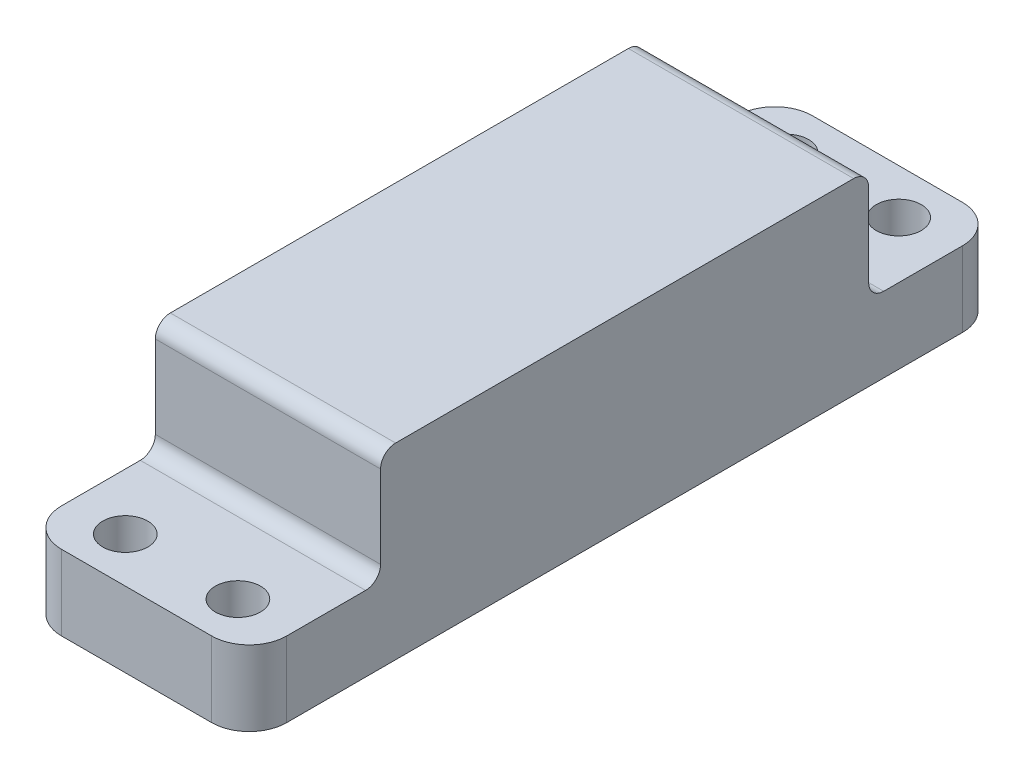
ISO-10303-21;
HEADER;
FILE_DESCRIPTION(('STEP AP214'),'2;1');
FILE_NAME('part.step','',(''),(''),'','','');
FILE_SCHEMA(('AUTOMOTIVE_DESIGN { 1 0 10303 214 1 1 1 1 }'));
ENDSEC;
DATA;
#1=APPLICATION_CONTEXT('core data for automotive mechanical design processes');
#2=APPLICATION_PROTOCOL_DEFINITION('international standard','automotive_design',2000,#1);
#3=PRODUCT_CONTEXT('',#1,'mechanical');
#4=PRODUCT('Part','Part','',(#3));
#5=PRODUCT_RELATED_PRODUCT_CATEGORY('part','',(#4));
#6=PRODUCT_DEFINITION_FORMATION('','',#4);
#7=PRODUCT_DEFINITION_CONTEXT('part definition',#1,'design');
#8=PRODUCT_DEFINITION('design','',#6,#7);
#9=PRODUCT_DEFINITION_SHAPE('','',#8);
#10=(LENGTH_UNIT() NAMED_UNIT(*) SI_UNIT(.MILLI.,.METRE.));
#11=(NAMED_UNIT(*) PLANE_ANGLE_UNIT() SI_UNIT($,.RADIAN.));
#12=(NAMED_UNIT(*) SI_UNIT($,.STERADIAN.) SOLID_ANGLE_UNIT());
#13=UNCERTAINTY_MEASURE_WITH_UNIT(LENGTH_MEASURE(1.E-05),#10,'distance_accuracy_value','');
#14=(GEOMETRIC_REPRESENTATION_CONTEXT(3) GLOBAL_UNCERTAINTY_ASSIGNED_CONTEXT((#13)) GLOBAL_UNIT_ASSIGNED_CONTEXT((#10,
#11,#12)) REPRESENTATION_CONTEXT('',''));
#15=CARTESIAN_POINT('',(0.,0.,0.));
#16=DIRECTION('',(0.,0.,1.));
#17=DIRECTION('',(1.,0.,0.));
#18=AXIS2_PLACEMENT_3D('',#15,#16,#17);
#19=CARTESIAN_POINT('',(30.,0.,-100.));
#20=DIRECTION('',(0.,0.,1.));
#21=DIRECTION('',(1.,0.,0.));
#22=AXIS2_PLACEMENT_3D('',#19,#20,#21);
#23=PLANE('',#22);
#24=DIRECTION('',(-1.,0.,0.));
#25=VECTOR('',#24,1.);
#26=CARTESIAN_POINT('',(30.,20.,-100.));
#27=LINE('',#26,#25);
#28=CARTESIAN_POINT('',(20.,20.,-100.));
#29=VERTEX_POINT('',#28);
#30=CARTESIAN_POINT('',(-20.,20.,-100.));
#31=VERTEX_POINT('',#30);
#32=EDGE_CURVE('E170',#29,#31,#27,.T.);
#33=ORIENTED_EDGE('',*,*,#32,.F.);
#34=DIRECTION('',(0.,1.,0.));
#35=VECTOR('',#34,1.);
#36=CARTESIAN_POINT('',(20.,0.,-100.));
#37=LINE('',#36,#35);
#38=CARTESIAN_POINT('',(20.,0.,-100.));
#39=VERTEX_POINT('',#38);
#40=EDGE_CURVE('E11',#29,#39,#37,.F.);
#41=ORIENTED_EDGE('',*,*,#40,.T.);
#42=DIRECTION('',(-1.,0.,0.));
#43=VECTOR('',#42,1.);
#44=CARTESIAN_POINT('',(30.,0.,-100.));
#45=LINE('',#44,#43);
#46=CARTESIAN_POINT('',(-20.,0.,-100.));
#47=VERTEX_POINT('',#46);
#48=EDGE_CURVE('E196',#39,#47,#45,.T.);
#49=ORIENTED_EDGE('',*,*,#48,.T.);
#50=DIRECTION('',(0.,1.,0.));
#51=VECTOR('',#50,1.);
#52=CARTESIAN_POINT('',(-20.,20.,-100.));
#53=LINE('',#52,#51);
#54=EDGE_CURVE('E47',#47,#31,#53,.T.);
#55=ORIENTED_EDGE('',*,*,#54,.T.);
#56=EDGE_LOOP('',(#33,#41,#49,#55));
#57=FACE_BOUND('',#56,.T.);
#58=ADVANCED_FACE('F39',(#57),#23,.F.);
#59=CARTESIAN_POINT('',(30.,20.,-100.));
#60=DIRECTION('',(0.,-1.,0.));
#61=DIRECTION('',(0.,0.,-1.));
#62=AXIS2_PLACEMENT_3D('',#59,#60,#61);
#63=PLANE('',#62);
#64=CARTESIAN_POINT('',(15.,20.,-88.));
#65=DIRECTION('',(0.,1.,0.));
#66=DIRECTION('',(0.,0.,1.));
#67=AXIS2_PLACEMENT_3D('',#64,#65,#66);
#68=CIRCLE('',#67,6.);
#69=CARTESIAN_POINT('',(15.,20.,-82.));
#70=VERTEX_POINT('',#69);
#71=EDGE_CURVE('E600',#70,#70,#68,.T.);
#72=ORIENTED_EDGE('',*,*,#71,.F.);
#73=EDGE_LOOP('',(#72));
#74=FACE_BOUND('',#73,.T.);
#75=CARTESIAN_POINT('',(-15.,20.,-88.));
#76=DIRECTION('',(0.,1.,0.));
#77=DIRECTION('',(0.,0.,1.));
#78=AXIS2_PLACEMENT_3D('',#75,#76,#77);
#79=CIRCLE('',#78,6.);
#80=CARTESIAN_POINT('',(-15.,20.,-82.));
#81=VERTEX_POINT('',#80);
#82=EDGE_CURVE('E612',#81,#81,#79,.T.);
#83=ORIENTED_EDGE('',*,*,#82,.F.);
#84=EDGE_LOOP('',(#83));
#85=FACE_BOUND('',#84,.T.);
#86=DIRECTION('',(0.,0.,1.));
#87=VECTOR('',#86,1.);
#88=CARTESIAN_POINT('',(30.,20.,-100.));
#89=LINE('',#88,#87);
#90=CARTESIAN_POINT('',(30.,20.,-90.));
#91=VERTEX_POINT('',#90);
#92=CARTESIAN_POINT('',(30.,20.,-69.));
#93=VERTEX_POINT('',#92);
#94=EDGE_CURVE('E152',#91,#93,#89,.T.);
#95=ORIENTED_EDGE('',*,*,#94,.F.);
#96=CARTESIAN_POINT('',(20.,20.,-90.));
#97=DIRECTION('',(0.,-1.,0.));
#98=DIRECTION('',(0.,0.,-1.));
#99=AXIS2_PLACEMENT_3D('',#96,#97,#98);
#100=CIRCLE('',#99,10.);
#101=EDGE_CURVE('E62',#91,#29,#100,.F.);
#102=ORIENTED_EDGE('',*,*,#101,.T.);
#103=ORIENTED_EDGE('',*,*,#32,.T.);
#104=CARTESIAN_POINT('',(-20.,20.,-90.));
#105=DIRECTION('',(0.,-1.,0.));
#106=DIRECTION('',(0.,0.,-1.));
#107=AXIS2_PLACEMENT_3D('',#104,#105,#106);
#108=CIRCLE('',#107,10.);
#109=CARTESIAN_POINT('',(-30.,20.,-90.));
#110=VERTEX_POINT('',#109);
#111=EDGE_CURVE('E54',#31,#110,#108,.F.);
#112=ORIENTED_EDGE('',*,*,#111,.T.);
#113=DIRECTION('',(0.,0.,1.));
#114=VECTOR('',#113,1.);
#115=CARTESIAN_POINT('',(-30.,20.,-100.));
#116=LINE('',#115,#114);
#117=CARTESIAN_POINT('',(-30.,20.,-69.));
#118=VERTEX_POINT('',#117);
#119=EDGE_CURVE('E167',#110,#118,#116,.T.);
#120=ORIENTED_EDGE('',*,*,#119,.T.);
#121=DIRECTION('',(-1.,0.,0.));
#122=VECTOR('',#121,1.);
#123=CARTESIAN_POINT('',(30.,20.,-69.));
#124=LINE('',#123,#122);
#125=EDGE_CURVE('E164',#93,#118,#124,.T.);
#126=ORIENTED_EDGE('',*,*,#125,.F.);
#127=EDGE_LOOP('',(#95,#102,#103,#112,#120,#126));
#128=FACE_BOUND('',#127,.T.);
#129=ADVANCED_FACE('F165',(#74,#85,#128),#63,.F.);
#130=CARTESIAN_POINT('',(30.,24.,-69.));
#131=DIRECTION('',(-1.,0.,0.));
#132=DIRECTION('',(0.,0.,1.));
#133=AXIS2_PLACEMENT_3D('',#130,#131,#132);
#134=CYLINDRICAL_SURFACE('',#133,4.);
#135=CARTESIAN_POINT('',(-30.,24.,-69.));
#136=DIRECTION('',(-1.,0.,0.));
#137=DIRECTION('',(0.,0.,1.));
#138=AXIS2_PLACEMENT_3D('',#135,#136,#137);
#139=CIRCLE('',#138,4.);
#140=CARTESIAN_POINT('',(-30.,24.,-65.));
#141=VERTEX_POINT('',#140);
#142=EDGE_CURVE('E198',#118,#141,#139,.T.);
#143=ORIENTED_EDGE('',*,*,#142,.T.);
#144=DIRECTION('',(-1.,0.,0.));
#145=VECTOR('',#144,1.);
#146=CARTESIAN_POINT('',(30.,24.,-65.));
#147=LINE('',#146,#145);
#148=CARTESIAN_POINT('',(30.,24.,-65.));
#149=VERTEX_POINT('',#148);
#150=EDGE_CURVE('E171',#149,#141,#147,.T.);
#151=ORIENTED_EDGE('',*,*,#150,.F.);
#152=CARTESIAN_POINT('',(30.,24.,-69.));
#153=DIRECTION('',(-1.,0.,0.));
#154=DIRECTION('',(0.,0.,1.));
#155=AXIS2_PLACEMENT_3D('',#152,#153,#154);
#156=CIRCLE('',#155,4.);
#157=EDGE_CURVE('E157',#93,#149,#156,.T.);
#158=ORIENTED_EDGE('',*,*,#157,.F.);
#159=ORIENTED_EDGE('',*,*,#125,.T.);
#160=EDGE_LOOP('',(#143,#151,#158,#159));
#161=FACE_BOUND('',#160,.T.);
#162=ADVANCED_FACE('F173',(#161),#134,.F.);
#163=CARTESIAN_POINT('',(30.,24.,-65.));
#164=DIRECTION('',(0.,0.,1.));
#165=DIRECTION('',(0.,-1.,0.));
#166=AXIS2_PLACEMENT_3D('',#163,#164,#165);
#167=PLANE('',#166);
#168=DIRECTION('',(0.,1.,0.));
#169=VECTOR('',#168,1.);
#170=CARTESIAN_POINT('',(-30.,24.,-65.));
#171=LINE('',#170,#169);
#172=CARTESIAN_POINT('',(-30.,46.,-65.));
#173=VERTEX_POINT('',#172);
#174=EDGE_CURVE('E201',#141,#173,#171,.T.);
#175=ORIENTED_EDGE('',*,*,#174,.T.);
#176=DIRECTION('',(-1.,0.,0.));
#177=VECTOR('',#176,1.);
#178=CARTESIAN_POINT('',(30.,46.,-65.));
#179=LINE('',#178,#177);
#180=CARTESIAN_POINT('',(30.,46.,-65.));
#181=VERTEX_POINT('',#180);
#182=EDGE_CURVE('E241',#181,#173,#179,.T.);
#183=ORIENTED_EDGE('',*,*,#182,.F.);
#184=DIRECTION('',(0.,1.,0.));
#185=VECTOR('',#184,1.);
#186=CARTESIAN_POINT('',(30.,24.,-65.));
#187=LINE('',#186,#185);
#188=EDGE_CURVE('E176',#149,#181,#187,.T.);
#189=ORIENTED_EDGE('',*,*,#188,.F.);
#190=ORIENTED_EDGE('',*,*,#150,.T.);
#191=EDGE_LOOP('',(#175,#183,#189,#190));
#192=FACE_BOUND('',#191,.T.);
#193=ADVANCED_FACE('F329',(#192),#167,.F.);
#194=CARTESIAN_POINT('',(30.,46.,-61.));
#195=DIRECTION('',(-1.,0.,0.));
#196=DIRECTION('',(0.,0.,1.));
#197=AXIS2_PLACEMENT_3D('',#194,#195,#196);
#198=CYLINDRICAL_SURFACE('',#197,4.);
#199=CARTESIAN_POINT('',(-30.,46.,-61.));
#200=DIRECTION('',(1.,0.,0.));
#201=DIRECTION('',(0.,0.,-1.));
#202=AXIS2_PLACEMENT_3D('',#199,#200,#201);
#203=CIRCLE('',#202,4.);
#204=CARTESIAN_POINT('',(-30.,50.,-61.));
#205=VERTEX_POINT('',#204);
#206=EDGE_CURVE('E203',#173,#205,#203,.T.);
#207=ORIENTED_EDGE('',*,*,#206,.T.);
#208=DIRECTION('',(-1.,0.,0.));
#209=VECTOR('',#208,1.);
#210=CARTESIAN_POINT('',(30.,50.,-61.));
#211=LINE('',#210,#209);
#212=CARTESIAN_POINT('',(30.,50.,-61.));
#213=VERTEX_POINT('',#212);
#214=EDGE_CURVE('E238',#213,#205,#211,.T.);
#215=ORIENTED_EDGE('',*,*,#214,.F.);
#216=CARTESIAN_POINT('',(30.,46.,-61.));
#217=DIRECTION('',(1.,0.,0.));
#218=DIRECTION('',(0.,0.,-1.));
#219=AXIS2_PLACEMENT_3D('',#216,#217,#218);
#220=CIRCLE('',#219,4.);
#221=EDGE_CURVE('E178',#181,#213,#220,.T.);
#222=ORIENTED_EDGE('',*,*,#221,.F.);
#223=ORIENTED_EDGE('',*,*,#182,.T.);
#224=EDGE_LOOP('',(#207,#215,#222,#223));
#225=FACE_BOUND('',#224,.T.);
#226=ADVANCED_FACE('F325',(#225),#198,.T.);
#227=CARTESIAN_POINT('',(30.,50.,61.));
#228=DIRECTION('',(0.,-1.,0.));
#229=DIRECTION('',(0.,0.,-1.));
#230=AXIS2_PLACEMENT_3D('',#227,#228,#229);
#231=PLANE('',#230);
#232=DIRECTION('',(0.,0.,1.));
#233=VECTOR('',#232,1.);
#234=CARTESIAN_POINT('',(-30.,50.,61.));
#235=LINE('',#234,#233);
#236=CARTESIAN_POINT('',(-30.,50.,61.));
#237=VERTEX_POINT('',#236);
#238=EDGE_CURVE('E205',#205,#237,#235,.T.);
#239=ORIENTED_EDGE('',*,*,#238,.T.);
#240=DIRECTION('',(-1.,0.,0.));
#241=VECTOR('',#240,1.);
#242=CARTESIAN_POINT('',(30.,50.,61.));
#243=LINE('',#242,#241);
#244=CARTESIAN_POINT('',(30.,50.,61.));
#245=VERTEX_POINT('',#244);
#246=EDGE_CURVE('E235',#245,#237,#243,.T.);
#247=ORIENTED_EDGE('',*,*,#246,.F.);
#248=DIRECTION('',(0.,0.,1.));
#249=VECTOR('',#248,1.);
#250=CARTESIAN_POINT('',(30.,50.,61.));
#251=LINE('',#250,#249);
#252=EDGE_CURVE('E183',#213,#245,#251,.T.);
#253=ORIENTED_EDGE('',*,*,#252,.F.);
#254=ORIENTED_EDGE('',*,*,#214,.T.);
#255=EDGE_LOOP('',(#239,#247,#253,#254));
#256=FACE_BOUND('',#255,.T.);
#257=ADVANCED_FACE('F321',(#256),#231,.F.);
#258=CARTESIAN_POINT('',(30.,46.,61.));
#259=DIRECTION('',(-1.,0.,0.));
#260=DIRECTION('',(0.,0.,1.));
#261=AXIS2_PLACEMENT_3D('',#258,#259,#260);
#262=CYLINDRICAL_SURFACE('',#261,4.);
#263=CARTESIAN_POINT('',(-30.,46.,61.));
#264=DIRECTION('',(1.,0.,0.));
#265=DIRECTION('',(0.,0.,1.));
#266=AXIS2_PLACEMENT_3D('',#263,#264,#265);
#267=CIRCLE('',#266,4.);
#268=CARTESIAN_POINT('',(-30.,46.,65.));
#269=VERTEX_POINT('',#268);
#270=EDGE_CURVE('E207',#237,#269,#267,.T.);
#271=ORIENTED_EDGE('',*,*,#270,.T.);
#272=DIRECTION('',(-1.,0.,0.));
#273=VECTOR('',#272,1.);
#274=CARTESIAN_POINT('',(30.,46.,65.));
#275=LINE('',#274,#273);
#276=CARTESIAN_POINT('',(30.,46.,65.));
#277=VERTEX_POINT('',#276);
#278=EDGE_CURVE('E232',#277,#269,#275,.T.);
#279=ORIENTED_EDGE('',*,*,#278,.F.);
#280=CARTESIAN_POINT('',(30.,46.,61.));
#281=DIRECTION('',(1.,0.,0.));
#282=DIRECTION('',(0.,0.,1.));
#283=AXIS2_PLACEMENT_3D('',#280,#281,#282);
#284=CIRCLE('',#283,4.);
#285=EDGE_CURVE('E185',#245,#277,#284,.T.);
#286=ORIENTED_EDGE('',*,*,#285,.F.);
#287=ORIENTED_EDGE('',*,*,#246,.T.);
#288=EDGE_LOOP('',(#271,#279,#286,#287));
#289=FACE_BOUND('',#288,.T.);
#290=ADVANCED_FACE('F317',(#289),#262,.T.);
#291=CARTESIAN_POINT('',(30.,24.,65.));
#292=DIRECTION('',(0.,0.,-1.));
#293=DIRECTION('',(0.,1.,0.));
#294=AXIS2_PLACEMENT_3D('',#291,#292,#293);
#295=PLANE('',#294);
#296=DIRECTION('',(0.,-1.,0.));
#297=VECTOR('',#296,1.);
#298=CARTESIAN_POINT('',(-30.,24.,65.));
#299=LINE('',#298,#297);
#300=CARTESIAN_POINT('',(-30.,24.,65.));
#301=VERTEX_POINT('',#300);
#302=EDGE_CURVE('E209',#269,#301,#299,.T.);
#303=ORIENTED_EDGE('',*,*,#302,.T.);
#304=DIRECTION('',(-1.,0.,0.));
#305=VECTOR('',#304,1.);
#306=CARTESIAN_POINT('',(30.,24.,65.));
#307=LINE('',#306,#305);
#308=CARTESIAN_POINT('',(30.,24.,65.));
#309=VERTEX_POINT('',#308);
#310=EDGE_CURVE('E229',#309,#301,#307,.T.);
#311=ORIENTED_EDGE('',*,*,#310,.F.);
#312=DIRECTION('',(0.,-1.,0.));
#313=VECTOR('',#312,1.);
#314=CARTESIAN_POINT('',(30.,24.,65.));
#315=LINE('',#314,#313);
#316=EDGE_CURVE('E187',#277,#309,#315,.T.);
#317=ORIENTED_EDGE('',*,*,#316,.F.);
#318=ORIENTED_EDGE('',*,*,#278,.T.);
#319=EDGE_LOOP('',(#303,#311,#317,#318));
#320=FACE_BOUND('',#319,.T.);
#321=ADVANCED_FACE('F313',(#320),#295,.F.);
#322=CARTESIAN_POINT('',(30.,24.,69.));
#323=DIRECTION('',(-1.,0.,0.));
#324=DIRECTION('',(0.,0.,1.));
#325=AXIS2_PLACEMENT_3D('',#322,#323,#324);
#326=CYLINDRICAL_SURFACE('',#325,4.);
#327=CARTESIAN_POINT('',(-30.,24.,69.));
#328=DIRECTION('',(-1.,0.,0.));
#329=DIRECTION('',(0.,0.,-1.));
#330=AXIS2_PLACEMENT_3D('',#327,#328,#329);
#331=CIRCLE('',#330,4.);
#332=CARTESIAN_POINT('',(-30.,20.,69.));
#333=VERTEX_POINT('',#332);
#334=EDGE_CURVE('E211',#301,#333,#331,.T.);
#335=ORIENTED_EDGE('',*,*,#334,.T.);
#336=DIRECTION('',(-1.,0.,0.));
#337=VECTOR('',#336,1.);
#338=CARTESIAN_POINT('',(30.,20.,69.));
#339=LINE('',#338,#337);
#340=CARTESIAN_POINT('',(30.,20.,69.));
#341=VERTEX_POINT('',#340);
#342=EDGE_CURVE('E226',#341,#333,#339,.T.);
#343=ORIENTED_EDGE('',*,*,#342,.F.);
#344=CARTESIAN_POINT('',(30.,24.,69.));
#345=DIRECTION('',(-1.,0.,0.));
#346=DIRECTION('',(0.,0.,-1.));
#347=AXIS2_PLACEMENT_3D('',#344,#345,#346);
#348=CIRCLE('',#347,4.);
#349=EDGE_CURVE('E189',#309,#341,#348,.T.);
#350=ORIENTED_EDGE('',*,*,#349,.F.);
#351=ORIENTED_EDGE('',*,*,#310,.T.);
#352=EDGE_LOOP('',(#335,#343,#350,#351));
#353=FACE_BOUND('',#352,.T.);
#354=ADVANCED_FACE('F307',(#353),#326,.F.);
#355=CARTESIAN_POINT('',(30.,20.,100.));
#356=DIRECTION('',(0.,-1.,0.));
#357=DIRECTION('',(0.,0.,-1.));
#358=AXIS2_PLACEMENT_3D('',#355,#356,#357);
#359=PLANE('',#358);
#360=CARTESIAN_POINT('',(-15.,20.,88.));
#361=DIRECTION('',(0.,1.,0.));
#362=DIRECTION('',(0.,0.,1.));
#363=AXIS2_PLACEMENT_3D('',#360,#361,#362);
#364=CIRCLE('',#363,6.);
#365=CARTESIAN_POINT('',(-15.,20.,94.));
#366=VERTEX_POINT('',#365);
#367=EDGE_CURVE('E578',#366,#366,#364,.T.);
#368=ORIENTED_EDGE('',*,*,#367,.F.);
#369=EDGE_LOOP('',(#368));
#370=FACE_BOUND('',#369,.T.);
#371=CARTESIAN_POINT('',(15.,20.,88.));
#372=DIRECTION('',(0.,1.,0.));
#373=DIRECTION('',(0.,0.,1.));
#374=AXIS2_PLACEMENT_3D('',#371,#372,#373);
#375=CIRCLE('',#374,6.);
#376=CARTESIAN_POINT('',(15.,20.,94.));
#377=VERTEX_POINT('',#376);
#378=EDGE_CURVE('E588',#377,#377,#375,.T.);
#379=ORIENTED_EDGE('',*,*,#378,.F.);
#380=EDGE_LOOP('',(#379));
#381=FACE_BOUND('',#380,.T.);
#382=DIRECTION('',(0.,0.,1.));
#383=VECTOR('',#382,1.);
#384=CARTESIAN_POINT('',(-30.,20.,100.));
#385=LINE('',#384,#383);
#386=CARTESIAN_POINT('',(-30.,20.,90.));
#387=VERTEX_POINT('',#386);
#388=EDGE_CURVE('E213',#333,#387,#385,.T.);
#389=ORIENTED_EDGE('',*,*,#388,.T.);
#390=CARTESIAN_POINT('',(-20.,20.,90.));
#391=DIRECTION('',(0.,-1.,0.));
#392=DIRECTION('',(0.,0.,-1.));
#393=AXIS2_PLACEMENT_3D('',#390,#391,#392);
#394=CIRCLE('',#393,10.);
#395=CARTESIAN_POINT('',(-20.,20.,100.));
#396=VERTEX_POINT('',#395);
#397=EDGE_CURVE('E265',#387,#396,#394,.F.);
#398=ORIENTED_EDGE('',*,*,#397,.T.);
#399=DIRECTION('',(-1.,0.,0.));
#400=VECTOR('',#399,1.);
#401=CARTESIAN_POINT('',(30.,20.,100.));
#402=LINE('',#401,#400);
#403=CARTESIAN_POINT('',(20.,20.,100.));
#404=VERTEX_POINT('',#403);
#405=EDGE_CURVE('E223',#404,#396,#402,.T.);
#406=ORIENTED_EDGE('',*,*,#405,.F.);
#407=CARTESIAN_POINT('',(20.,20.,90.));
#408=DIRECTION('',(0.,-1.,0.));
#409=DIRECTION('',(0.,0.,-1.));
#410=AXIS2_PLACEMENT_3D('',#407,#408,#409);
#411=CIRCLE('',#410,10.);
#412=CARTESIAN_POINT('',(30.,20.,90.));
#413=VERTEX_POINT('',#412);
#414=EDGE_CURVE('E263',#404,#413,#411,.F.);
#415=ORIENTED_EDGE('',*,*,#414,.T.);
#416=DIRECTION('',(0.,0.,1.));
#417=VECTOR('',#416,1.);
#418=CARTESIAN_POINT('',(30.,20.,100.));
#419=LINE('',#418,#417);
#420=EDGE_CURVE('E191',#341,#413,#419,.T.);
#421=ORIENTED_EDGE('',*,*,#420,.F.);
#422=ORIENTED_EDGE('',*,*,#342,.T.);
#423=EDGE_LOOP('',(#389,#398,#406,#415,#421,#422));
#424=FACE_BOUND('',#423,.T.);
#425=ADVANCED_FACE('F292',(#370,#381,#424),#359,.F.);
#426=CARTESIAN_POINT('',(30.,0.,100.));
#427=DIRECTION('',(0.,0.,-1.));
#428=DIRECTION('',(-1.,0.,0.));
#429=AXIS2_PLACEMENT_3D('',#426,#427,#428);
#430=PLANE('',#429);
#431=ORIENTED_EDGE('',*,*,#405,.T.);
#432=DIRECTION('',(0.,-1.,0.));
#433=VECTOR('',#432,1.);
#434=CARTESIAN_POINT('',(-20.,0.,100.));
#435=LINE('',#434,#433);
#436=CARTESIAN_POINT('',(-20.,0.,100.));
#437=VERTEX_POINT('',#436);
#438=EDGE_CURVE('E248',#396,#437,#435,.T.);
#439=ORIENTED_EDGE('',*,*,#438,.T.);
#440=DIRECTION('',(-1.,0.,0.));
#441=VECTOR('',#440,1.);
#442=CARTESIAN_POINT('',(30.,0.,100.));
#443=LINE('',#442,#441);
#444=CARTESIAN_POINT('',(20.,0.,100.));
#445=VERTEX_POINT('',#444);
#446=EDGE_CURVE('E220',#445,#437,#443,.T.);
#447=ORIENTED_EDGE('',*,*,#446,.F.);
#448=DIRECTION('',(0.,-1.,0.));
#449=VECTOR('',#448,1.);
#450=CARTESIAN_POINT('',(20.,0.,100.));
#451=LINE('',#450,#449);
#452=EDGE_CURVE('E246',#445,#404,#451,.F.);
#453=ORIENTED_EDGE('',*,*,#452,.T.);
#454=EDGE_LOOP('',(#431,#439,#447,#453));
#455=FACE_BOUND('',#454,.T.);
#456=ADVANCED_FACE('F295',(#455),#430,.F.);
#457=CARTESIAN_POINT('',(30.,0.,-100.));
#458=DIRECTION('',(0.,1.,0.));
#459=DIRECTION('',(0.,0.,1.));
#460=AXIS2_PLACEMENT_3D('',#457,#458,#459);
#461=PLANE('',#460);
#462=CARTESIAN_POINT('',(-15.,0.,88.));
#463=DIRECTION('',(0.,1.,0.));
#464=DIRECTION('',(0.,0.,1.));
#465=AXIS2_PLACEMENT_3D('',#462,#463,#464);
#466=CIRCLE('',#465,4.);
#467=CARTESIAN_POINT('',(-15.,0.,92.));
#468=VERTEX_POINT('',#467);
#469=EDGE_CURVE('E585',#468,#468,#466,.T.);
#470=ORIENTED_EDGE('',*,*,#469,.T.);
#471=EDGE_LOOP('',(#470));
#472=FACE_BOUND('',#471,.T.);
#473=CARTESIAN_POINT('',(15.,0.,88.));
#474=DIRECTION('',(0.,1.,0.));
#475=DIRECTION('',(0.,0.,1.));
#476=AXIS2_PLACEMENT_3D('',#473,#474,#475);
#477=CIRCLE('',#476,4.);
#478=CARTESIAN_POINT('',(15.,0.,92.));
#479=VERTEX_POINT('',#478);
#480=EDGE_CURVE('E597',#479,#479,#477,.T.);
#481=ORIENTED_EDGE('',*,*,#480,.T.);
#482=EDGE_LOOP('',(#481));
#483=FACE_BOUND('',#482,.T.);
#484=CARTESIAN_POINT('',(15.,0.,-88.));
#485=DIRECTION('',(0.,1.,0.));
#486=DIRECTION('',(0.,0.,1.));
#487=AXIS2_PLACEMENT_3D('',#484,#485,#486);
#488=CIRCLE('',#487,4.);
#489=CARTESIAN_POINT('',(15.,0.,-84.));
#490=VERTEX_POINT('',#489);
#491=EDGE_CURVE('E609',#490,#490,#488,.T.);
#492=ORIENTED_EDGE('',*,*,#491,.T.);
#493=EDGE_LOOP('',(#492));
#494=FACE_BOUND('',#493,.T.);
#495=CARTESIAN_POINT('',(-15.,0.,-88.));
#496=DIRECTION('',(0.,1.,0.));
#497=DIRECTION('',(0.,0.,1.));
#498=AXIS2_PLACEMENT_3D('',#495,#496,#497);
#499=CIRCLE('',#498,4.);
#500=CARTESIAN_POINT('',(-15.,0.,-84.));
#501=VERTEX_POINT('',#500);
#502=EDGE_CURVE('E199',#501,#501,#499,.T.);
#503=ORIENTED_EDGE('',*,*,#502,.T.);
#504=EDGE_LOOP('',(#503));
#505=FACE_BOUND('',#504,.T.);
#506=ORIENTED_EDGE('',*,*,#446,.T.);
#507=CARTESIAN_POINT('',(-20.,0.,90.));
#508=DIRECTION('',(0.,1.,0.));
#509=DIRECTION('',(0.,0.,1.));
#510=AXIS2_PLACEMENT_3D('',#507,#508,#509);
#511=CIRCLE('',#510,10.);
#512=CARTESIAN_POINT('',(-30.,0.,90.));
#513=VERTEX_POINT('',#512);
#514=EDGE_CURVE('E257',#437,#513,#511,.F.);
#515=ORIENTED_EDGE('',*,*,#514,.T.);
#516=DIRECTION('',(0.,0.,-1.));
#517=VECTOR('',#516,1.);
#518=CARTESIAN_POINT('',(-30.,0.,-100.));
#519=LINE('',#518,#517);
#520=CARTESIAN_POINT('',(-30.,0.,-90.));
#521=VERTEX_POINT('',#520);
#522=EDGE_CURVE('E161',#513,#521,#519,.T.);
#523=ORIENTED_EDGE('',*,*,#522,.T.);
#524=CARTESIAN_POINT('',(-20.,0.,-90.));
#525=DIRECTION('',(0.,1.,0.));
#526=DIRECTION('',(0.,0.,1.));
#527=AXIS2_PLACEMENT_3D('',#524,#525,#526);
#528=CIRCLE('',#527,10.);
#529=EDGE_CURVE('E253',#521,#47,#528,.F.);
#530=ORIENTED_EDGE('',*,*,#529,.T.);
#531=ORIENTED_EDGE('',*,*,#48,.F.);
#532=CARTESIAN_POINT('',(20.,0.,-90.));
#533=DIRECTION('',(0.,1.,0.));
#534=DIRECTION('',(0.,0.,1.));
#535=AXIS2_PLACEMENT_3D('',#532,#533,#534);
#536=CIRCLE('',#535,10.);
#537=CARTESIAN_POINT('',(30.,0.,-90.));
#538=VERTEX_POINT('',#537);
#539=EDGE_CURVE('E255',#39,#538,#536,.F.);
#540=ORIENTED_EDGE('',*,*,#539,.T.);
#541=DIRECTION('',(0.,0.,-1.));
#542=VECTOR('',#541,1.);
#543=CARTESIAN_POINT('',(30.,0.,-100.));
#544=LINE('',#543,#542);
#545=CARTESIAN_POINT('',(30.,0.,90.));
#546=VERTEX_POINT('',#545);
#547=EDGE_CURVE('E194',#546,#538,#544,.T.);
#548=ORIENTED_EDGE('',*,*,#547,.F.);
#549=CARTESIAN_POINT('',(20.,0.,90.));
#550=DIRECTION('',(0.,1.,0.));
#551=DIRECTION('',(0.,0.,1.));
#552=AXIS2_PLACEMENT_3D('',#549,#550,#551);
#553=CIRCLE('',#552,10.);
#554=EDGE_CURVE('E251',#546,#445,#553,.F.);
#555=ORIENTED_EDGE('',*,*,#554,.T.);
#556=EDGE_LOOP('',(#506,#515,#523,#530,#531,#540,#548,#555));
#557=FACE_BOUND('',#556,.T.);
#558=ADVANCED_FACE('F282',(#472,#483,#494,#505,#557),#461,.F.);
#559=CARTESIAN_POINT('',(30.,24.,-69.));
#560=DIRECTION('',(-1.,0.,0.));
#561=DIRECTION('',(0.,0.,1.));
#562=AXIS2_PLACEMENT_3D('',#559,#560,#561);
#563=PLANE('',#562);
#564=ORIENTED_EDGE('',*,*,#547,.T.);
#565=DIRECTION('',(0.,1.,0.));
#566=VECTOR('',#565,1.);
#567=CARTESIAN_POINT('',(30.,24.,-90.));
#568=LINE('',#567,#566);
#569=EDGE_CURVE('E160',#538,#91,#568,.T.);
#570=ORIENTED_EDGE('',*,*,#569,.T.);
#571=ORIENTED_EDGE('',*,*,#94,.T.);
#572=ORIENTED_EDGE('',*,*,#157,.T.);
#573=ORIENTED_EDGE('',*,*,#188,.T.);
#574=ORIENTED_EDGE('',*,*,#221,.T.);
#575=ORIENTED_EDGE('',*,*,#252,.T.);
#576=ORIENTED_EDGE('',*,*,#285,.T.);
#577=ORIENTED_EDGE('',*,*,#316,.T.);
#578=ORIENTED_EDGE('',*,*,#349,.T.);
#579=ORIENTED_EDGE('',*,*,#420,.T.);
#580=DIRECTION('',(0.,-1.,0.));
#581=VECTOR('',#580,1.);
#582=CARTESIAN_POINT('',(30.,24.,90.));
#583=LINE('',#582,#581);
#584=EDGE_CURVE('E267',#413,#546,#583,.T.);
#585=ORIENTED_EDGE('',*,*,#584,.T.);
#586=EDGE_LOOP('',(#564,#570,#571,#572,#573,#574,#575,#576,#577,#578,#579,#585));
#587=FACE_BOUND('',#586,.T.);
#588=ADVANCED_FACE('F155',(#587),#563,.F.);
#589=CARTESIAN_POINT('',(-30.,24.,-69.));
#590=DIRECTION('',(-1.,0.,0.));
#591=DIRECTION('',(0.,0.,1.));
#592=AXIS2_PLACEMENT_3D('',#589,#590,#591);
#593=PLANE('',#592);
#594=ORIENTED_EDGE('',*,*,#522,.F.);
#595=DIRECTION('',(0.,-1.,0.));
#596=VECTOR('',#595,1.);
#597=CARTESIAN_POINT('',(-30.,20.,90.));
#598=LINE('',#597,#596);
#599=EDGE_CURVE('E261',#513,#387,#598,.F.);
#600=ORIENTED_EDGE('',*,*,#599,.T.);
#601=ORIENTED_EDGE('',*,*,#388,.F.);
#602=ORIENTED_EDGE('',*,*,#334,.F.);
#603=ORIENTED_EDGE('',*,*,#302,.F.);
#604=ORIENTED_EDGE('',*,*,#270,.F.);
#605=ORIENTED_EDGE('',*,*,#238,.F.);
#606=ORIENTED_EDGE('',*,*,#206,.F.);
#607=ORIENTED_EDGE('',*,*,#174,.F.);
#608=ORIENTED_EDGE('',*,*,#142,.F.);
#609=ORIENTED_EDGE('',*,*,#119,.F.);
#610=DIRECTION('',(0.,1.,0.));
#611=VECTOR('',#610,1.);
#612=CARTESIAN_POINT('',(-30.,0.,-90.));
#613=LINE('',#612,#611);
#614=EDGE_CURVE('E259',#110,#521,#613,.F.);
#615=ORIENTED_EDGE('',*,*,#614,.T.);
#616=EDGE_LOOP('',(#594,#600,#601,#602,#603,#604,#605,#606,#607,#608,#609,#615));
#617=FACE_BOUND('',#616,.T.);
#618=ADVANCED_FACE('F278',(#617),#593,.T.);
#619=CARTESIAN_POINT('',(-20.,0.,90.));
#620=DIRECTION('',(0.,1.,0.));
#621=DIRECTION('',(0.,0.,1.));
#622=AXIS2_PLACEMENT_3D('',#619,#620,#621);
#623=CYLINDRICAL_SURFACE('',#622,10.);
#624=ORIENTED_EDGE('',*,*,#397,.F.);
#625=ORIENTED_EDGE('',*,*,#599,.F.);
#626=ORIENTED_EDGE('',*,*,#514,.F.);
#627=ORIENTED_EDGE('',*,*,#438,.F.);
#628=EDGE_LOOP('',(#624,#625,#626,#627));
#629=FACE_BOUND('',#628,.T.);
#630=ADVANCED_FACE('F288',(#629),#623,.T.);
#631=CARTESIAN_POINT('',(20.,24.,-90.));
#632=DIRECTION('',(0.,1.,0.));
#633=DIRECTION('',(0.,0.,1.));
#634=AXIS2_PLACEMENT_3D('',#631,#632,#633);
#635=CYLINDRICAL_SURFACE('',#634,10.);
#636=ORIENTED_EDGE('',*,*,#539,.F.);
#637=ORIENTED_EDGE('',*,*,#40,.F.);
#638=ORIENTED_EDGE('',*,*,#101,.F.);
#639=ORIENTED_EDGE('',*,*,#569,.F.);
#640=EDGE_LOOP('',(#636,#637,#638,#639));
#641=FACE_BOUND('',#640,.T.);
#642=ADVANCED_FACE('F350',(#641),#635,.T.);
#643=CARTESIAN_POINT('',(-20.,0.,-90.));
#644=DIRECTION('',(0.,-1.,0.));
#645=DIRECTION('',(0.,0.,-1.));
#646=AXIS2_PLACEMENT_3D('',#643,#644,#645);
#647=CYLINDRICAL_SURFACE('',#646,10.);
#648=ORIENTED_EDGE('',*,*,#529,.F.);
#649=ORIENTED_EDGE('',*,*,#614,.F.);
#650=ORIENTED_EDGE('',*,*,#111,.F.);
#651=ORIENTED_EDGE('',*,*,#54,.F.);
#652=EDGE_LOOP('',(#648,#649,#650,#651));
#653=FACE_BOUND('',#652,.T.);
#654=ADVANCED_FACE('F280',(#653),#647,.T.);
#655=CARTESIAN_POINT('',(20.,24.,90.));
#656=DIRECTION('',(0.,-1.,0.));
#657=DIRECTION('',(0.,0.,-1.));
#658=AXIS2_PLACEMENT_3D('',#655,#656,#657);
#659=CYLINDRICAL_SURFACE('',#658,10.);
#660=ORIENTED_EDGE('',*,*,#414,.F.);
#661=ORIENTED_EDGE('',*,*,#452,.F.);
#662=ORIENTED_EDGE('',*,*,#554,.F.);
#663=ORIENTED_EDGE('',*,*,#584,.F.);
#664=EDGE_LOOP('',(#660,#661,#662,#663));
#665=FACE_BOUND('',#664,.T.);
#666=ADVANCED_FACE('F41',(#665),#659,.T.);
#667=CARTESIAN_POINT('',(-15.,20.,-88.));
#668=DIRECTION('',(0.,1.,0.));
#669=DIRECTION('',(0.,0.,1.));
#670=AXIS2_PLACEMENT_3D('',#667,#668,#669);
#671=CYLINDRICAL_SURFACE('',#670,4.);
#672=ORIENTED_EDGE('',*,*,#502,.F.);
#673=EDGE_LOOP('',(#672));
#674=FACE_BOUND('',#673,.T.);
#675=CARTESIAN_POINT('',(-15.,10.,-88.));
#676=DIRECTION('',(0.,1.,0.));
#677=DIRECTION('',(0.,0.,1.));
#678=AXIS2_PLACEMENT_3D('',#675,#676,#677);
#679=CIRCLE('',#678,4.);
#680=CARTESIAN_POINT('',(-15.,10.,-84.));
#681=VERTEX_POINT('',#680);
#682=EDGE_CURVE('E618',#681,#681,#679,.T.);
#683=ORIENTED_EDGE('',*,*,#682,.T.);
#684=EDGE_LOOP('',(#683));
#685=FACE_BOUND('',#684,.T.);
#686=ADVANCED_FACE('F357',(#674,#685),#671,.F.);
#687=CARTESIAN_POINT('',(-11.,10.,-88.));
#688=DIRECTION('',(0.,-1.,0.));
#689=DIRECTION('',(0.,0.,-1.));
#690=AXIS2_PLACEMENT_3D('',#687,#688,#689);
#691=PLANE('',#690);
#692=ORIENTED_EDGE('',*,*,#682,.F.);
#693=EDGE_LOOP('',(#692));
#694=FACE_BOUND('',#693,.T.);
#695=CARTESIAN_POINT('',(-15.,10.,-88.));
#696=DIRECTION('',(0.,1.,0.));
#697=DIRECTION('',(0.,0.,1.));
#698=AXIS2_PLACEMENT_3D('',#695,#696,#697);
#699=CIRCLE('',#698,6.);
#700=CARTESIAN_POINT('',(-15.,10.,-82.));
#701=VERTEX_POINT('',#700);
#702=EDGE_CURVE('E615',#701,#701,#699,.T.);
#703=ORIENTED_EDGE('',*,*,#702,.T.);
#704=EDGE_LOOP('',(#703));
#705=FACE_BOUND('',#704,.T.);
#706=ADVANCED_FACE('F361',(#694,#705),#691,.F.);
#707=CARTESIAN_POINT('',(-15.,20.,-88.));
#708=DIRECTION('',(0.,1.,0.));
#709=DIRECTION('',(0.,0.,1.));
#710=AXIS2_PLACEMENT_3D('',#707,#708,#709);
#711=CYLINDRICAL_SURFACE('',#710,6.);
#712=ORIENTED_EDGE('',*,*,#702,.F.);
#713=EDGE_LOOP('',(#712));
#714=FACE_BOUND('',#713,.T.);
#715=ORIENTED_EDGE('',*,*,#82,.T.);
#716=EDGE_LOOP('',(#715));
#717=FACE_BOUND('',#716,.T.);
#718=ADVANCED_FACE('F368',(#714,#717),#711,.F.);
#719=CARTESIAN_POINT('',(15.,20.,-88.));
#720=DIRECTION('',(0.,1.,0.));
#721=DIRECTION('',(0.,0.,1.));
#722=AXIS2_PLACEMENT_3D('',#719,#720,#721);
#723=CYLINDRICAL_SURFACE('',#722,4.);
#724=ORIENTED_EDGE('',*,*,#491,.F.);
#725=EDGE_LOOP('',(#724));
#726=FACE_BOUND('',#725,.T.);
#727=CARTESIAN_POINT('',(15.,10.,-88.));
#728=DIRECTION('',(0.,1.,0.));
#729=DIRECTION('',(0.,0.,1.));
#730=AXIS2_PLACEMENT_3D('',#727,#728,#729);
#731=CIRCLE('',#730,4.);
#732=CARTESIAN_POINT('',(15.,10.,-84.));
#733=VERTEX_POINT('',#732);
#734=EDGE_CURVE('E606',#733,#733,#731,.T.);
#735=ORIENTED_EDGE('',*,*,#734,.T.);
#736=EDGE_LOOP('',(#735));
#737=FACE_BOUND('',#736,.T.);
#738=ADVANCED_FACE('F480',(#726,#737),#723,.F.);
#739=CARTESIAN_POINT('',(19.,10.,-88.));
#740=DIRECTION('',(0.,-1.,0.));
#741=DIRECTION('',(0.,0.,-1.));
#742=AXIS2_PLACEMENT_3D('',#739,#740,#741);
#743=PLANE('',#742);
#744=ORIENTED_EDGE('',*,*,#734,.F.);
#745=EDGE_LOOP('',(#744));
#746=FACE_BOUND('',#745,.T.);
#747=CARTESIAN_POINT('',(15.,10.,-88.));
#748=DIRECTION('',(0.,1.,0.));
#749=DIRECTION('',(0.,0.,1.));
#750=AXIS2_PLACEMENT_3D('',#747,#748,#749);
#751=CIRCLE('',#750,6.);
#752=CARTESIAN_POINT('',(15.,10.,-82.));
#753=VERTEX_POINT('',#752);
#754=EDGE_CURVE('E603',#753,#753,#751,.T.);
#755=ORIENTED_EDGE('',*,*,#754,.T.);
#756=EDGE_LOOP('',(#755));
#757=FACE_BOUND('',#756,.T.);
#758=ADVANCED_FACE('F489',(#746,#757),#743,.F.);
#759=CARTESIAN_POINT('',(15.,20.,-88.));
#760=DIRECTION('',(0.,1.,0.));
#761=DIRECTION('',(0.,0.,1.));
#762=AXIS2_PLACEMENT_3D('',#759,#760,#761);
#763=CYLINDRICAL_SURFACE('',#762,6.);
#764=ORIENTED_EDGE('',*,*,#754,.F.);
#765=EDGE_LOOP('',(#764));
#766=FACE_BOUND('',#765,.T.);
#767=ORIENTED_EDGE('',*,*,#71,.T.);
#768=EDGE_LOOP('',(#767));
#769=FACE_BOUND('',#768,.T.);
#770=ADVANCED_FACE('F499',(#766,#769),#763,.F.);
#771=CARTESIAN_POINT('',(15.,20.,88.));
#772=DIRECTION('',(0.,1.,0.));
#773=DIRECTION('',(0.,0.,1.));
#774=AXIS2_PLACEMENT_3D('',#771,#772,#773);
#775=CYLINDRICAL_SURFACE('',#774,4.);
#776=ORIENTED_EDGE('',*,*,#480,.F.);
#777=EDGE_LOOP('',(#776));
#778=FACE_BOUND('',#777,.T.);
#779=CARTESIAN_POINT('',(15.,9.99999999999998,88.));
#780=DIRECTION('',(0.,1.,0.));
#781=DIRECTION('',(0.,0.,1.));
#782=AXIS2_PLACEMENT_3D('',#779,#780,#781);
#783=CIRCLE('',#782,4.);
#784=CARTESIAN_POINT('',(15.,9.99999999999998,92.));
#785=VERTEX_POINT('',#784);
#786=EDGE_CURVE('E594',#785,#785,#783,.T.);
#787=ORIENTED_EDGE('',*,*,#786,.T.);
#788=EDGE_LOOP('',(#787));
#789=FACE_BOUND('',#788,.T.);
#790=ADVANCED_FACE('F509',(#778,#789),#775,.F.);
#791=CARTESIAN_POINT('',(19.,9.99999999999998,88.));
#792=DIRECTION('',(0.,-1.,0.));
#793=DIRECTION('',(0.,0.,-1.));
#794=AXIS2_PLACEMENT_3D('',#791,#792,#793);
#795=PLANE('',#794);
#796=ORIENTED_EDGE('',*,*,#786,.F.);
#797=EDGE_LOOP('',(#796));
#798=FACE_BOUND('',#797,.T.);
#799=CARTESIAN_POINT('',(15.,9.99999999999998,88.));
#800=DIRECTION('',(0.,1.,0.));
#801=DIRECTION('',(0.,0.,1.));
#802=AXIS2_PLACEMENT_3D('',#799,#800,#801);
#803=CIRCLE('',#802,6.);
#804=CARTESIAN_POINT('',(15.,9.99999999999998,94.));
#805=VERTEX_POINT('',#804);
#806=EDGE_CURVE('E591',#805,#805,#803,.T.);
#807=ORIENTED_EDGE('',*,*,#806,.T.);
#808=EDGE_LOOP('',(#807));
#809=FACE_BOUND('',#808,.T.);
#810=ADVANCED_FACE('F519',(#798,#809),#795,.F.);
#811=CARTESIAN_POINT('',(15.,20.,88.));
#812=DIRECTION('',(0.,1.,0.));
#813=DIRECTION('',(0.,0.,1.));
#814=AXIS2_PLACEMENT_3D('',#811,#812,#813);
#815=CYLINDRICAL_SURFACE('',#814,6.);
#816=ORIENTED_EDGE('',*,*,#806,.F.);
#817=EDGE_LOOP('',(#816));
#818=FACE_BOUND('',#817,.T.);
#819=ORIENTED_EDGE('',*,*,#378,.T.);
#820=EDGE_LOOP('',(#819));
#821=FACE_BOUND('',#820,.T.);
#822=ADVANCED_FACE('F529',(#818,#821),#815,.F.);
#823=CARTESIAN_POINT('',(-15.,20.,88.));
#824=DIRECTION('',(0.,1.,0.));
#825=DIRECTION('',(0.,0.,1.));
#826=AXIS2_PLACEMENT_3D('',#823,#824,#825);
#827=CYLINDRICAL_SURFACE('',#826,4.);
#828=ORIENTED_EDGE('',*,*,#469,.F.);
#829=EDGE_LOOP('',(#828));
#830=FACE_BOUND('',#829,.T.);
#831=CARTESIAN_POINT('',(-15.,9.99999999999998,88.));
#832=DIRECTION('',(0.,1.,0.));
#833=DIRECTION('',(0.,0.,1.));
#834=AXIS2_PLACEMENT_3D('',#831,#832,#833);
#835=CIRCLE('',#834,4.);
#836=CARTESIAN_POINT('',(-15.,9.99999999999998,92.));
#837=VERTEX_POINT('',#836);
#838=EDGE_CURVE('E580',#837,#837,#835,.T.);
#839=ORIENTED_EDGE('',*,*,#838,.T.);
#840=EDGE_LOOP('',(#839));
#841=FACE_BOUND('',#840,.T.);
#842=ADVANCED_FACE('F539',(#830,#841),#827,.F.);
#843=CARTESIAN_POINT('',(-11.,9.99999999999998,88.));
#844=DIRECTION('',(0.,-1.,0.));
#845=DIRECTION('',(0.,0.,-1.));
#846=AXIS2_PLACEMENT_3D('',#843,#844,#845);
#847=PLANE('',#846);
#848=ORIENTED_EDGE('',*,*,#838,.F.);
#849=EDGE_LOOP('',(#848));
#850=FACE_BOUND('',#849,.T.);
#851=CARTESIAN_POINT('',(-15.,9.99999999999998,88.));
#852=DIRECTION('',(0.,1.,0.));
#853=DIRECTION('',(0.,0.,1.));
#854=AXIS2_PLACEMENT_3D('',#851,#852,#853);
#855=CIRCLE('',#854,6.);
#856=CARTESIAN_POINT('',(-15.,9.99999999999998,94.));
#857=VERTEX_POINT('',#856);
#858=EDGE_CURVE('E575',#857,#857,#855,.T.);
#859=ORIENTED_EDGE('',*,*,#858,.T.);
#860=EDGE_LOOP('',(#859));
#861=FACE_BOUND('',#860,.T.);
#862=ADVANCED_FACE('F549',(#850,#861),#847,.F.);
#863=CARTESIAN_POINT('',(-15.,20.,88.));
#864=DIRECTION('',(0.,1.,0.));
#865=DIRECTION('',(0.,0.,1.));
#866=AXIS2_PLACEMENT_3D('',#863,#864,#865);
#867=CYLINDRICAL_SURFACE('',#866,6.);
#868=ORIENTED_EDGE('',*,*,#858,.F.);
#869=EDGE_LOOP('',(#868));
#870=FACE_BOUND('',#869,.T.);
#871=ORIENTED_EDGE('',*,*,#367,.T.);
#872=EDGE_LOOP('',(#871));
#873=FACE_BOUND('',#872,.T.);
#874=ADVANCED_FACE('F559',(#870,#873),#867,.F.);
#875=CLOSED_SHELL('',(#58,#129,#162,#193,#226,#257,#290,#321,#354,#425,#456,#558,#588,#618,#630,
#642,#654,#666,#686,#706,#718,#738,#758,#770,#790,#810,#822,#842,#862,#874));
#876=MANIFOLD_SOLID_BREP('B2',#875);
#877=ADVANCED_BREP_SHAPE_REPRESENTATION('',(#18,#876),#14);
#878=SHAPE_DEFINITION_REPRESENTATION(#9,#877);
ENDSEC;
END-ISO-10303-21;
